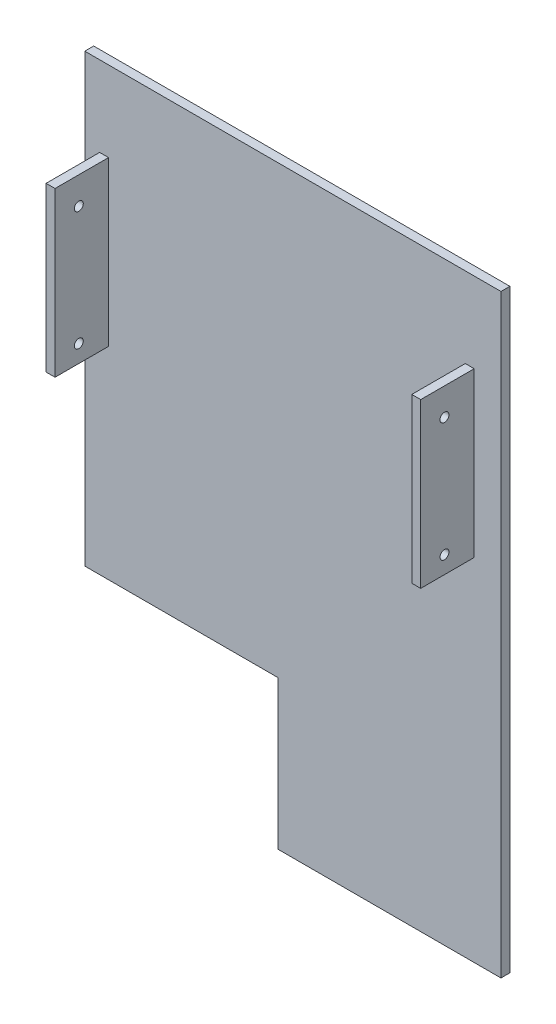
ISO-10303-21;
HEADER;
FILE_DESCRIPTION(('STEP AP214'),'2;1');
FILE_NAME('part.step','',(''),(''),'','','');
FILE_SCHEMA(('AUTOMOTIVE_DESIGN { 1 0 10303 214 1 1 1 1 }'));
ENDSEC;
DATA;
#1=APPLICATION_CONTEXT('core data for automotive mechanical design processes');
#2=APPLICATION_PROTOCOL_DEFINITION('international standard','automotive_design',2000,#1);
#3=PRODUCT_CONTEXT('',#1,'mechanical');
#4=PRODUCT('Part','Part','',(#3));
#5=PRODUCT_RELATED_PRODUCT_CATEGORY('part','',(#4));
#6=PRODUCT_DEFINITION_FORMATION('','',#4);
#7=PRODUCT_DEFINITION_CONTEXT('part definition',#1,'design');
#8=PRODUCT_DEFINITION('design','',#6,#7);
#9=PRODUCT_DEFINITION_SHAPE('','',#8);
#10=(LENGTH_UNIT() NAMED_UNIT(*) SI_UNIT(.MILLI.,.METRE.));
#11=(NAMED_UNIT(*) PLANE_ANGLE_UNIT() SI_UNIT($,.RADIAN.));
#12=(NAMED_UNIT(*) SI_UNIT($,.STERADIAN.) SOLID_ANGLE_UNIT());
#13=UNCERTAINTY_MEASURE_WITH_UNIT(LENGTH_MEASURE(1.E-05),#10,'distance_accuracy_value','');
#14=(GEOMETRIC_REPRESENTATION_CONTEXT(3) GLOBAL_UNCERTAINTY_ASSIGNED_CONTEXT((#13)) GLOBAL_UNIT_ASSIGNED_CONTEXT((#10,
#11,#12)) REPRESENTATION_CONTEXT('',''));
#15=CARTESIAN_POINT('',(0.,0.,0.));
#16=DIRECTION('',(0.,0.,1.));
#17=DIRECTION('',(1.,0.,0.));
#18=AXIS2_PLACEMENT_3D('',#15,#16,#17);
#19=CARTESIAN_POINT('',(0.,0.,3.));
#20=DIRECTION('',(0.,0.,1.));
#21=DIRECTION('',(1.,0.,0.));
#22=AXIS2_PLACEMENT_3D('',#19,#20,#21);
#23=PLANE('',#22);
#24=DIRECTION('',(1.,0.,0.));
#25=VECTOR('',#24,1.);
#26=CARTESIAN_POINT('',(0.,-27.,3.));
#27=LINE('',#26,#25);
#28=CARTESIAN_POINT('',(5.,-27.,3.));
#29=VERTEX_POINT('',#28);
#30=CARTESIAN_POINT('',(8.,-27.,3.));
#31=VERTEX_POINT('',#30);
#32=EDGE_CURVE('E177',#29,#31,#27,.T.);
#33=ORIENTED_EDGE('',*,*,#32,.T.);
#34=DIRECTION('',(0.,-1.,0.));
#35=VECTOR('',#34,1.);
#36=CARTESIAN_POINT('',(8.,0.,3.));
#37=LINE('',#36,#35);
#38=CARTESIAN_POINT('',(8.,-82.,3.));
#39=VERTEX_POINT('',#38);
#40=EDGE_CURVE('E187',#31,#39,#37,.T.);
#41=ORIENTED_EDGE('',*,*,#40,.T.);
#42=DIRECTION('',(1.,0.,0.));
#43=VECTOR('',#42,1.);
#44=CARTESIAN_POINT('',(0.,-82.,3.));
#45=LINE('',#44,#43);
#46=CARTESIAN_POINT('',(5.00000000000001,-82.,3.));
#47=VERTEX_POINT('',#46);
#48=EDGE_CURVE('E197',#47,#39,#45,.T.);
#49=ORIENTED_EDGE('',*,*,#48,.F.);
#50=DIRECTION('',(0.,-1.,0.));
#51=VECTOR('',#50,1.);
#52=CARTESIAN_POINT('',(5.,0.,3.));
#53=LINE('',#52,#51);
#54=EDGE_CURVE('E62',#29,#47,#53,.T.);
#55=ORIENTED_EDGE('',*,*,#54,.F.);
#56=EDGE_LOOP('',(#33,#41,#49,#55));
#57=FACE_BOUND('',#56,.T.);
#58=DIRECTION('',(0.,1.,0.));
#59=VECTOR('',#58,1.);
#60=CARTESIAN_POINT('',(65.,0.,3.));
#61=LINE('',#60,#59);
#62=CARTESIAN_POINT('',(65.,-200.,3.));
#63=VERTEX_POINT('',#62);
#64=CARTESIAN_POINT('',(65.,-150.,3.));
#65=VERTEX_POINT('',#64);
#66=EDGE_CURVE('E225',#63,#65,#61,.T.);
#67=ORIENTED_EDGE('',*,*,#66,.F.);
#68=DIRECTION('',(1.,0.,0.));
#69=VECTOR('',#68,1.);
#70=CARTESIAN_POINT('',(0.,-200.,3.));
#71=LINE('',#70,#69);
#72=CARTESIAN_POINT('',(140.,-200.,3.));
#73=VERTEX_POINT('',#72);
#74=EDGE_CURVE('E231',#63,#73,#71,.T.);
#75=ORIENTED_EDGE('',*,*,#74,.T.);
#76=DIRECTION('',(0.,1.,0.));
#77=VECTOR('',#76,1.);
#78=CARTESIAN_POINT('',(140.,0.,3.));
#79=LINE('',#78,#77);
#80=CARTESIAN_POINT('',(140.,0.,3.));
#81=VERTEX_POINT('',#80);
#82=EDGE_CURVE('E234',#73,#81,#79,.T.);
#83=ORIENTED_EDGE('',*,*,#82,.T.);
#84=DIRECTION('',(-1.,0.,0.));
#85=VECTOR('',#84,1.);
#86=CARTESIAN_POINT('',(0.,0.,3.));
#87=LINE('',#86,#85);
#88=CARTESIAN_POINT('',(0.,0.,3.));
#89=VERTEX_POINT('',#88);
#90=EDGE_CURVE('E236',#81,#89,#87,.T.);
#91=ORIENTED_EDGE('',*,*,#90,.T.);
#92=DIRECTION('',(0.,-1.,0.));
#93=VECTOR('',#92,1.);
#94=CARTESIAN_POINT('',(0.,0.,3.));
#95=LINE('',#94,#93);
#96=CARTESIAN_POINT('',(0.,-150.,3.));
#97=VERTEX_POINT('',#96);
#98=EDGE_CURVE('E228',#89,#97,#95,.T.);
#99=ORIENTED_EDGE('',*,*,#98,.T.);
#100=DIRECTION('',(-1.,0.,0.));
#101=VECTOR('',#100,1.);
#102=CARTESIAN_POINT('',(0.,-150.,3.));
#103=LINE('',#102,#101);
#104=EDGE_CURVE('E219',#65,#97,#103,.T.);
#105=ORIENTED_EDGE('',*,*,#104,.F.);
#106=EDGE_LOOP('',(#67,#75,#83,#91,#99,#105));
#107=FACE_BOUND('',#106,.T.);
#108=DIRECTION('',(0.,1.,0.));
#109=VECTOR('',#108,1.);
#110=CARTESIAN_POINT('',(128.,-82.,3.));
#111=LINE('',#110,#109);
#112=CARTESIAN_POINT('',(128.,-82.,3.));
#113=VERTEX_POINT('',#112);
#114=CARTESIAN_POINT('',(128.,-27.,3.));
#115=VERTEX_POINT('',#114);
#116=EDGE_CURVE('E54',#113,#115,#111,.T.);
#117=ORIENTED_EDGE('',*,*,#116,.T.);
#118=DIRECTION('',(-1.,0.,0.));
#119=VECTOR('',#118,1.);
#120=CARTESIAN_POINT('',(131.,-27.,3.));
#121=LINE('',#120,#119);
#122=CARTESIAN_POINT('',(131.,-27.,3.));
#123=VERTEX_POINT('',#122);
#124=EDGE_CURVE('E506',#123,#115,#121,.T.);
#125=ORIENTED_EDGE('',*,*,#124,.F.);
#126=DIRECTION('',(0.,1.,0.));
#127=VECTOR('',#126,1.);
#128=CARTESIAN_POINT('',(131.,-82.,3.));
#129=LINE('',#128,#127);
#130=CARTESIAN_POINT('',(131.,-82.,3.));
#131=VERTEX_POINT('',#130);
#132=EDGE_CURVE('E159',#131,#123,#129,.T.);
#133=ORIENTED_EDGE('',*,*,#132,.F.);
#134=DIRECTION('',(-1.,0.,0.));
#135=VECTOR('',#134,1.);
#136=CARTESIAN_POINT('',(131.,-82.,3.));
#137=LINE('',#136,#135);
#138=EDGE_CURVE('E170',#131,#113,#137,.T.);
#139=ORIENTED_EDGE('',*,*,#138,.T.);
#140=EDGE_LOOP('',(#117,#125,#133,#139));
#141=FACE_BOUND('',#140,.T.);
#142=ADVANCED_FACE('F39',(#57,#107,#141),#23,.T.);
#143=CARTESIAN_POINT('',(0.,0.,3.));
#144=DIRECTION('',(1.,0.,0.));
#145=DIRECTION('',(0.,1.,0.));
#146=AXIS2_PLACEMENT_3D('',#143,#144,#145);
#147=PLANE('',#146);
#148=DIRECTION('',(0.,-1.,0.));
#149=VECTOR('',#148,1.);
#150=CARTESIAN_POINT('',(0.,0.,0.));
#151=LINE('',#150,#149);
#152=CARTESIAN_POINT('',(0.,0.,0.));
#153=VERTEX_POINT('',#152);
#154=CARTESIAN_POINT('',(0.,-150.,0.));
#155=VERTEX_POINT('',#154);
#156=EDGE_CURVE('E227',#153,#155,#151,.T.);
#157=ORIENTED_EDGE('',*,*,#156,.T.);
#158=DIRECTION('',(0.,0.,-1.));
#159=VECTOR('',#158,1.);
#160=CARTESIAN_POINT('',(0.,-150.,10.));
#161=LINE('',#160,#159);
#162=EDGE_CURVE('E220',#97,#155,#161,.T.);
#163=ORIENTED_EDGE('',*,*,#162,.F.);
#164=ORIENTED_EDGE('',*,*,#98,.F.);
#165=DIRECTION('',(0.,0.,-1.));
#166=VECTOR('',#165,1.);
#167=CARTESIAN_POINT('',(0.,0.,3.));
#168=LINE('',#167,#166);
#169=EDGE_CURVE('E238',#89,#153,#168,.T.);
#170=ORIENTED_EDGE('',*,*,#169,.T.);
#171=EDGE_LOOP('',(#157,#163,#164,#170));
#172=FACE_BOUND('',#171,.T.);
#173=ADVANCED_FACE('F41',(#172),#147,.F.);
#174=CARTESIAN_POINT('',(0.,-200.,3.));
#175=DIRECTION('',(0.,1.,0.));
#176=DIRECTION('',(0.,0.,1.));
#177=AXIS2_PLACEMENT_3D('',#174,#175,#176);
#178=PLANE('',#177);
#179=ORIENTED_EDGE('',*,*,#74,.F.);
#180=DIRECTION('',(0.,0.,-1.));
#181=VECTOR('',#180,1.);
#182=CARTESIAN_POINT('',(65.,-200.,10.));
#183=LINE('',#182,#181);
#184=CARTESIAN_POINT('',(65.,-200.,0.));
#185=VERTEX_POINT('',#184);
#186=EDGE_CURVE('E216',#63,#185,#183,.T.);
#187=ORIENTED_EDGE('',*,*,#186,.T.);
#188=DIRECTION('',(1.,0.,0.));
#189=VECTOR('',#188,1.);
#190=CARTESIAN_POINT('',(0.,-200.,0.));
#191=LINE('',#190,#189);
#192=CARTESIAN_POINT('',(140.,-200.,0.));
#193=VERTEX_POINT('',#192);
#194=EDGE_CURVE('E241',#185,#193,#191,.T.);
#195=ORIENTED_EDGE('',*,*,#194,.T.);
#196=DIRECTION('',(0.,0.,-1.));
#197=VECTOR('',#196,1.);
#198=CARTESIAN_POINT('',(140.,-200.,3.));
#199=LINE('',#198,#197);
#200=EDGE_CURVE('E11',#73,#193,#199,.T.);
#201=ORIENTED_EDGE('',*,*,#200,.F.);
#202=EDGE_LOOP('',(#179,#187,#195,#201));
#203=FACE_BOUND('',#202,.T.);
#204=ADVANCED_FACE('F274',(#203),#178,.F.);
#205=CARTESIAN_POINT('',(140.,0.,3.));
#206=DIRECTION('',(-1.,0.,0.));
#207=DIRECTION('',(0.,-1.,0.));
#208=AXIS2_PLACEMENT_3D('',#205,#206,#207);
#209=PLANE('',#208);
#210=DIRECTION('',(0.,1.,0.));
#211=VECTOR('',#210,1.);
#212=CARTESIAN_POINT('',(140.,0.,0.));
#213=LINE('',#212,#211);
#214=CARTESIAN_POINT('',(140.,0.,0.));
#215=VERTEX_POINT('',#214);
#216=EDGE_CURVE('E243',#193,#215,#213,.T.);
#217=ORIENTED_EDGE('',*,*,#216,.T.);
#218=DIRECTION('',(0.,0.,-1.));
#219=VECTOR('',#218,1.);
#220=CARTESIAN_POINT('',(140.,0.,3.));
#221=LINE('',#220,#219);
#222=EDGE_CURVE('E47',#81,#215,#221,.T.);
#223=ORIENTED_EDGE('',*,*,#222,.F.);
#224=ORIENTED_EDGE('',*,*,#82,.F.);
#225=ORIENTED_EDGE('',*,*,#200,.T.);
#226=EDGE_LOOP('',(#217,#223,#224,#225));
#227=FACE_BOUND('',#226,.T.);
#228=ADVANCED_FACE('F272',(#227),#209,.F.);
#229=CARTESIAN_POINT('',(0.,0.,3.));
#230=DIRECTION('',(0.,-1.,0.));
#231=DIRECTION('',(0.,0.,-1.));
#232=AXIS2_PLACEMENT_3D('',#229,#230,#231);
#233=PLANE('',#232);
#234=DIRECTION('',(-1.,0.,0.));
#235=VECTOR('',#234,1.);
#236=CARTESIAN_POINT('',(0.,0.,0.));
#237=LINE('',#236,#235);
#238=EDGE_CURVE('E232',#215,#153,#237,.T.);
#239=ORIENTED_EDGE('',*,*,#238,.T.);
#240=ORIENTED_EDGE('',*,*,#169,.F.);
#241=ORIENTED_EDGE('',*,*,#90,.F.);
#242=ORIENTED_EDGE('',*,*,#222,.T.);
#243=EDGE_LOOP('',(#239,#240,#241,#242));
#244=FACE_BOUND('',#243,.T.);
#245=ADVANCED_FACE('F252',(#244),#233,.F.);
#246=CARTESIAN_POINT('',(0.,0.,0.));
#247=DIRECTION('',(0.,0.,1.));
#248=DIRECTION('',(1.,0.,0.));
#249=AXIS2_PLACEMENT_3D('',#246,#247,#248);
#250=PLANE('',#249);
#251=ORIENTED_EDGE('',*,*,#194,.F.);
#252=DIRECTION('',(0.,-1.,0.));
#253=VECTOR('',#252,1.);
#254=CARTESIAN_POINT('',(65.,-200.,0.));
#255=LINE('',#254,#253);
#256=CARTESIAN_POINT('',(65.,-150.,0.));
#257=VERTEX_POINT('',#256);
#258=EDGE_CURVE('E211',#257,#185,#255,.T.);
#259=ORIENTED_EDGE('',*,*,#258,.F.);
#260=DIRECTION('',(1.,0.,0.));
#261=VECTOR('',#260,1.);
#262=CARTESIAN_POINT('',(65.,-150.,0.));
#263=LINE('',#262,#261);
#264=EDGE_CURVE('E213',#155,#257,#263,.T.);
#265=ORIENTED_EDGE('',*,*,#264,.F.);
#266=ORIENTED_EDGE('',*,*,#156,.F.);
#267=ORIENTED_EDGE('',*,*,#238,.F.);
#268=ORIENTED_EDGE('',*,*,#216,.F.);
#269=EDGE_LOOP('',(#251,#259,#265,#266,#267,#268));
#270=FACE_BOUND('',#269,.T.);
#271=ADVANCED_FACE('F260',(#270),#250,.F.);
#272=CARTESIAN_POINT('',(65.,-200.,10.));
#273=DIRECTION('',(1.,0.,0.));
#274=DIRECTION('',(0.,0.,-1.));
#275=AXIS2_PLACEMENT_3D('',#272,#273,#274);
#276=PLANE('',#275);
#277=ORIENTED_EDGE('',*,*,#66,.T.);
#278=DIRECTION('',(0.,0.,-1.));
#279=VECTOR('',#278,1.);
#280=CARTESIAN_POINT('',(65.,-150.,10.));
#281=LINE('',#280,#279);
#282=EDGE_CURVE('E217',#65,#257,#281,.T.);
#283=ORIENTED_EDGE('',*,*,#282,.T.);
#284=ORIENTED_EDGE('',*,*,#258,.T.);
#285=ORIENTED_EDGE('',*,*,#186,.F.);
#286=EDGE_LOOP('',(#277,#283,#284,#285));
#287=FACE_BOUND('',#286,.T.);
#288=ADVANCED_FACE('F276',(#287),#276,.F.);
#289=CARTESIAN_POINT('',(65.,-150.,10.));
#290=DIRECTION('',(0.,1.,0.));
#291=DIRECTION('',(0.,0.,1.));
#292=AXIS2_PLACEMENT_3D('',#289,#290,#291);
#293=PLANE('',#292);
#294=ORIENTED_EDGE('',*,*,#104,.T.);
#295=ORIENTED_EDGE('',*,*,#162,.T.);
#296=ORIENTED_EDGE('',*,*,#264,.T.);
#297=ORIENTED_EDGE('',*,*,#282,.F.);
#298=EDGE_LOOP('',(#294,#295,#296,#297));
#299=FACE_BOUND('',#298,.T.);
#300=ADVANCED_FACE('F279',(#299),#293,.F.);
#301=CARTESIAN_POINT('',(0.,-27.,21.));
#302=DIRECTION('',(0.,1.,0.));
#303=DIRECTION('',(0.,0.,1.));
#304=AXIS2_PLACEMENT_3D('',#301,#302,#303);
#305=PLANE('',#304);
#306=ORIENTED_EDGE('',*,*,#32,.F.);
#307=DIRECTION('',(0.,0.,-1.));
#308=VECTOR('',#307,1.);
#309=CARTESIAN_POINT('',(5.,-27.,21.));
#310=LINE('',#309,#308);
#311=CARTESIAN_POINT('',(5.,-27.,21.));
#312=VERTEX_POINT('',#311);
#313=EDGE_CURVE('E209',#312,#29,#310,.T.);
#314=ORIENTED_EDGE('',*,*,#313,.F.);
#315=DIRECTION('',(1.,0.,0.));
#316=VECTOR('',#315,1.);
#317=CARTESIAN_POINT('',(0.,-27.,21.));
#318=LINE('',#317,#316);
#319=CARTESIAN_POINT('',(8.,-27.,21.));
#320=VERTEX_POINT('',#319);
#321=EDGE_CURVE('E183',#312,#320,#318,.T.);
#322=ORIENTED_EDGE('',*,*,#321,.T.);
#323=DIRECTION('',(0.,0.,-1.));
#324=VECTOR('',#323,1.);
#325=CARTESIAN_POINT('',(8.,-27.,21.));
#326=LINE('',#325,#324);
#327=EDGE_CURVE('E194',#320,#31,#326,.T.);
#328=ORIENTED_EDGE('',*,*,#327,.T.);
#329=EDGE_LOOP('',(#306,#314,#322,#328));
#330=FACE_BOUND('',#329,.T.);
#331=ADVANCED_FACE('F281',(#330),#305,.T.);
#332=CARTESIAN_POINT('',(5.,0.,21.));
#333=DIRECTION('',(1.,0.,0.));
#334=DIRECTION('',(0.,1.,0.));
#335=AXIS2_PLACEMENT_3D('',#332,#333,#334);
#336=PLANE('',#335);
#337=CARTESIAN_POINT('',(5.00000000000001,-76.1644741197591,13.0000000000001));
#338=DIRECTION('',(-1.,0.,0.));
#339=DIRECTION('',(0.,-1.,0.));
#340=AXIS2_PLACEMENT_3D('',#337,#338,#339);
#341=CIRCLE('',#340,1.5);
#342=CARTESIAN_POINT('',(5.00000000000001,-77.6644741197591,13.0000000000001));
#343=VERTEX_POINT('',#342);
#344=EDGE_CURVE('E174',#343,#343,#341,.T.);
#345=ORIENTED_EDGE('',*,*,#344,.F.);
#346=EDGE_LOOP('',(#345));
#347=FACE_BOUND('',#346,.T.);
#348=CARTESIAN_POINT('',(5.,-36.1644741197591,13.0000000000001));
#349=DIRECTION('',(-1.,0.,0.));
#350=DIRECTION('',(0.,-1.,0.));
#351=AXIS2_PLACEMENT_3D('',#348,#349,#350);
#352=CIRCLE('',#351,1.5);
#353=CARTESIAN_POINT('',(5.,-37.6644741197591,13.0000000000001));
#354=VERTEX_POINT('',#353);
#355=EDGE_CURVE('E165',#354,#354,#352,.T.);
#356=ORIENTED_EDGE('',*,*,#355,.F.);
#357=EDGE_LOOP('',(#356));
#358=FACE_BOUND('',#357,.T.);
#359=ORIENTED_EDGE('',*,*,#54,.T.);
#360=DIRECTION('',(0.,0.,-1.));
#361=VECTOR('',#360,1.);
#362=CARTESIAN_POINT('',(5.00000000000001,-82.,21.));
#363=LINE('',#362,#361);
#364=CARTESIAN_POINT('',(5.00000000000001,-82.,21.));
#365=VERTEX_POINT('',#364);
#366=EDGE_CURVE('E206',#365,#47,#363,.T.);
#367=ORIENTED_EDGE('',*,*,#366,.F.);
#368=DIRECTION('',(0.,-1.,0.));
#369=VECTOR('',#368,1.);
#370=CARTESIAN_POINT('',(5.,0.,21.));
#371=LINE('',#370,#369);
#372=EDGE_CURVE('E186',#312,#365,#371,.T.);
#373=ORIENTED_EDGE('',*,*,#372,.F.);
#374=ORIENTED_EDGE('',*,*,#313,.T.);
#375=EDGE_LOOP('',(#359,#367,#373,#374));
#376=FACE_BOUND('',#375,.T.);
#377=ADVANCED_FACE('F287',(#347,#358,#376),#336,.F.);
#378=CARTESIAN_POINT('',(0.,-82.,21.));
#379=DIRECTION('',(0.,1.,0.));
#380=DIRECTION('',(0.,0.,1.));
#381=AXIS2_PLACEMENT_3D('',#378,#379,#380);
#382=PLANE('',#381);
#383=ORIENTED_EDGE('',*,*,#48,.T.);
#384=DIRECTION('',(0.,0.,-1.));
#385=VECTOR('',#384,1.);
#386=CARTESIAN_POINT('',(8.,-82.,21.));
#387=LINE('',#386,#385);
#388=CARTESIAN_POINT('',(8.,-82.,21.));
#389=VERTEX_POINT('',#388);
#390=EDGE_CURVE('E203',#389,#39,#387,.T.);
#391=ORIENTED_EDGE('',*,*,#390,.F.);
#392=DIRECTION('',(1.,0.,0.));
#393=VECTOR('',#392,1.);
#394=CARTESIAN_POINT('',(0.,-82.,21.));
#395=LINE('',#394,#393);
#396=EDGE_CURVE('E189',#365,#389,#395,.T.);
#397=ORIENTED_EDGE('',*,*,#396,.F.);
#398=ORIENTED_EDGE('',*,*,#366,.T.);
#399=EDGE_LOOP('',(#383,#391,#397,#398));
#400=FACE_BOUND('',#399,.T.);
#401=ADVANCED_FACE('F343',(#400),#382,.F.);
#402=CARTESIAN_POINT('',(8.,0.,21.));
#403=DIRECTION('',(1.,0.,0.));
#404=DIRECTION('',(0.,0.,-1.));
#405=AXIS2_PLACEMENT_3D('',#402,#403,#404);
#406=PLANE('',#405);
#407=CARTESIAN_POINT('',(8.00000000000001,-76.1644741197591,13.0000000000001));
#408=DIRECTION('',(1.,0.,0.));
#409=DIRECTION('',(0.,0.,-1.));
#410=AXIS2_PLACEMENT_3D('',#407,#408,#409);
#411=CIRCLE('',#410,1.5);
#412=CARTESIAN_POINT('',(8.00000000000001,-76.1644741197591,11.5000000000001));
#413=VERTEX_POINT('',#412);
#414=EDGE_CURVE('E178',#413,#413,#411,.F.);
#415=ORIENTED_EDGE('',*,*,#414,.T.);
#416=EDGE_LOOP('',(#415));
#417=FACE_BOUND('',#416,.T.);
#418=CARTESIAN_POINT('',(8.00000000000001,-36.1644741197591,13.0000000000001));
#419=DIRECTION('',(1.,0.,0.));
#420=DIRECTION('',(0.,0.,-1.));
#421=AXIS2_PLACEMENT_3D('',#418,#419,#420);
#422=CIRCLE('',#421,1.5);
#423=CARTESIAN_POINT('',(8.00000000000001,-36.1644741197591,11.5000000000001));
#424=VERTEX_POINT('',#423);
#425=EDGE_CURVE('E168',#424,#424,#422,.F.);
#426=ORIENTED_EDGE('',*,*,#425,.T.);
#427=EDGE_LOOP('',(#426));
#428=FACE_BOUND('',#427,.T.);
#429=ORIENTED_EDGE('',*,*,#40,.F.);
#430=ORIENTED_EDGE('',*,*,#327,.F.);
#431=DIRECTION('',(0.,-1.,0.));
#432=VECTOR('',#431,1.);
#433=CARTESIAN_POINT('',(8.,0.,21.));
#434=LINE('',#433,#432);
#435=EDGE_CURVE('E191',#320,#389,#434,.T.);
#436=ORIENTED_EDGE('',*,*,#435,.T.);
#437=ORIENTED_EDGE('',*,*,#390,.T.);
#438=EDGE_LOOP('',(#429,#430,#436,#437));
#439=FACE_BOUND('',#438,.T.);
#440=ADVANCED_FACE('F348',(#417,#428,#439),#406,.T.);
#441=CARTESIAN_POINT('',(0.,0.,21.));
#442=DIRECTION('',(0.,0.,1.));
#443=DIRECTION('',(1.,0.,0.));
#444=AXIS2_PLACEMENT_3D('',#441,#442,#443);
#445=PLANE('',#444);
#446=ORIENTED_EDGE('',*,*,#321,.F.);
#447=ORIENTED_EDGE('',*,*,#372,.T.);
#448=ORIENTED_EDGE('',*,*,#396,.T.);
#449=ORIENTED_EDGE('',*,*,#435,.F.);
#450=EDGE_LOOP('',(#446,#447,#448,#449));
#451=FACE_BOUND('',#450,.T.);
#452=ADVANCED_FACE('F357',(#451),#445,.T.);
#453=CARTESIAN_POINT('',(140.001,-36.164474119759,13.0000000000001));
#454=DIRECTION('',(-1.,0.,0.));
#455=DIRECTION('',(0.,-1.,0.));
#456=AXIS2_PLACEMENT_3D('',#453,#454,#455);
#457=CYLINDRICAL_SURFACE('',#456,1.5);
#458=ORIENTED_EDGE('',*,*,#425,.F.);
#459=EDGE_LOOP('',(#458));
#460=FACE_BOUND('',#459,.T.);
#461=ORIENTED_EDGE('',*,*,#355,.T.);
#462=EDGE_LOOP('',(#461));
#463=FACE_BOUND('',#462,.T.);
#464=ADVANCED_FACE('F362',(#460,#463),#457,.F.);
#465=CARTESIAN_POINT('',(140.001,-76.164474119759,13.0000000000001));
#466=DIRECTION('',(-1.,0.,0.));
#467=DIRECTION('',(0.,-1.,0.));
#468=AXIS2_PLACEMENT_3D('',#465,#466,#467);
#469=CYLINDRICAL_SURFACE('',#468,1.5);
#470=ORIENTED_EDGE('',*,*,#414,.F.);
#471=EDGE_LOOP('',(#470));
#472=FACE_BOUND('',#471,.T.);
#473=ORIENTED_EDGE('',*,*,#344,.T.);
#474=EDGE_LOOP('',(#473));
#475=FACE_BOUND('',#474,.T.);
#476=ADVANCED_FACE('F389',(#472,#475),#469,.F.);
#477=CARTESIAN_POINT('',(131.,0.,0.));
#478=DIRECTION('',(1.,0.,0.));
#479=DIRECTION('',(0.,0.,-1.));
#480=AXIS2_PLACEMENT_3D('',#477,#478,#479);
#481=PLANE('',#480);
#482=CARTESIAN_POINT('',(131.,-76.1644741197591,13.0000000000001));
#483=DIRECTION('',(1.,0.,0.));
#484=DIRECTION('',(0.,0.,-1.));
#485=AXIS2_PLACEMENT_3D('',#482,#483,#484);
#486=CIRCLE('',#485,1.5);
#487=CARTESIAN_POINT('',(131.,-76.1644741197591,11.5000000000001));
#488=VERTEX_POINT('',#487);
#489=EDGE_CURVE('E499',#488,#488,#486,.T.);
#490=ORIENTED_EDGE('',*,*,#489,.F.);
#491=EDGE_LOOP('',(#490));
#492=FACE_BOUND('',#491,.T.);
#493=DIRECTION('',(0.,0.,1.));
#494=VECTOR('',#493,1.);
#495=CARTESIAN_POINT('',(131.,-27.,3.));
#496=LINE('',#495,#494);
#497=CARTESIAN_POINT('',(131.,-27.,21.));
#498=VERTEX_POINT('',#497);
#499=EDGE_CURVE('E153',#123,#498,#496,.T.);
#500=ORIENTED_EDGE('',*,*,#499,.T.);
#501=DIRECTION('',(0.,-1.,0.));
#502=VECTOR('',#501,1.);
#503=CARTESIAN_POINT('',(131.,-27.,21.));
#504=LINE('',#503,#502);
#505=CARTESIAN_POINT('',(131.,-82.,21.));
#506=VERTEX_POINT('',#505);
#507=EDGE_CURVE('E142',#498,#506,#504,.T.);
#508=ORIENTED_EDGE('',*,*,#507,.T.);
#509=DIRECTION('',(0.,0.,-1.));
#510=VECTOR('',#509,1.);
#511=CARTESIAN_POINT('',(131.,-82.,21.));
#512=LINE('',#511,#510);
#513=EDGE_CURVE('E152',#506,#131,#512,.T.);
#514=ORIENTED_EDGE('',*,*,#513,.T.);
#515=ORIENTED_EDGE('',*,*,#132,.T.);
#516=EDGE_LOOP('',(#500,#508,#514,#515));
#517=FACE_BOUND('',#516,.T.);
#518=CARTESIAN_POINT('',(131.,-36.1644741197591,13.0000000000001));
#519=DIRECTION('',(1.,0.,0.));
#520=DIRECTION('',(0.,0.,-1.));
#521=AXIS2_PLACEMENT_3D('',#518,#519,#520);
#522=CIRCLE('',#521,1.5);
#523=CARTESIAN_POINT('',(131.,-36.1644741197591,11.5000000000001));
#524=VERTEX_POINT('',#523);
#525=EDGE_CURVE('E490',#524,#524,#522,.T.);
#526=ORIENTED_EDGE('',*,*,#525,.F.);
#527=EDGE_LOOP('',(#526));
#528=FACE_BOUND('',#527,.T.);
#529=ADVANCED_FACE('F156',(#492,#517,#528),#481,.T.);
#530=CARTESIAN_POINT('',(128.,0.,0.));
#531=DIRECTION('',(1.,0.,0.));
#532=DIRECTION('',(0.,0.,-1.));
#533=AXIS2_PLACEMENT_3D('',#530,#531,#532);
#534=PLANE('',#533);
#535=DIRECTION('',(0.,0.,1.));
#536=VECTOR('',#535,1.);
#537=CARTESIAN_POINT('',(128.,-27.,3.));
#538=LINE('',#537,#536);
#539=CARTESIAN_POINT('',(128.,-27.,21.));
#540=VERTEX_POINT('',#539);
#541=EDGE_CURVE('E164',#115,#540,#538,.T.);
#542=ORIENTED_EDGE('',*,*,#541,.F.);
#543=ORIENTED_EDGE('',*,*,#116,.F.);
#544=DIRECTION('',(0.,0.,-1.));
#545=VECTOR('',#544,1.);
#546=CARTESIAN_POINT('',(128.,-82.,21.));
#547=LINE('',#546,#545);
#548=CARTESIAN_POINT('',(128.,-82.,21.));
#549=VERTEX_POINT('',#548);
#550=EDGE_CURVE('E510',#549,#113,#547,.T.);
#551=ORIENTED_EDGE('',*,*,#550,.F.);
#552=DIRECTION('',(0.,-1.,0.));
#553=VECTOR('',#552,1.);
#554=CARTESIAN_POINT('',(128.,-27.,21.));
#555=LINE('',#554,#553);
#556=EDGE_CURVE('E508',#540,#549,#555,.T.);
#557=ORIENTED_EDGE('',*,*,#556,.F.);
#558=EDGE_LOOP('',(#542,#543,#551,#557));
#559=FACE_BOUND('',#558,.T.);
#560=CARTESIAN_POINT('',(128.,-76.1644741197591,13.0000000000001));
#561=DIRECTION('',(1.,0.,0.));
#562=DIRECTION('',(0.,0.,-1.));
#563=AXIS2_PLACEMENT_3D('',#560,#561,#562);
#564=CIRCLE('',#563,1.5);
#565=CARTESIAN_POINT('',(128.,-76.1644741197591,11.5000000000001));
#566=VERTEX_POINT('',#565);
#567=EDGE_CURVE('E496',#566,#566,#564,.T.);
#568=ORIENTED_EDGE('',*,*,#567,.T.);
#569=EDGE_LOOP('',(#568));
#570=FACE_BOUND('',#569,.T.);
#571=CARTESIAN_POINT('',(128.,-36.1644741197591,13.0000000000001));
#572=DIRECTION('',(1.,0.,0.));
#573=DIRECTION('',(0.,0.,-1.));
#574=AXIS2_PLACEMENT_3D('',#571,#572,#573);
#575=CIRCLE('',#574,1.5);
#576=CARTESIAN_POINT('',(128.,-36.1644741197591,11.5000000000001));
#577=VERTEX_POINT('',#576);
#578=EDGE_CURVE('E493',#577,#577,#575,.T.);
#579=ORIENTED_EDGE('',*,*,#578,.T.);
#580=EDGE_LOOP('',(#579));
#581=FACE_BOUND('',#580,.T.);
#582=ADVANCED_FACE('F415',(#559,#570,#581),#534,.F.);
#583=CARTESIAN_POINT('',(131.,-27.,3.));
#584=DIRECTION('',(0.,-1.,0.));
#585=DIRECTION('',(0.,0.,-1.));
#586=AXIS2_PLACEMENT_3D('',#583,#584,#585);
#587=PLANE('',#586);
#588=ORIENTED_EDGE('',*,*,#541,.T.);
#589=DIRECTION('',(-1.,0.,0.));
#590=VECTOR('',#589,1.);
#591=CARTESIAN_POINT('',(131.,-27.,21.));
#592=LINE('',#591,#590);
#593=EDGE_CURVE('E146',#498,#540,#592,.T.);
#594=ORIENTED_EDGE('',*,*,#593,.F.);
#595=ORIENTED_EDGE('',*,*,#499,.F.);
#596=ORIENTED_EDGE('',*,*,#124,.T.);
#597=EDGE_LOOP('',(#588,#594,#595,#596));
#598=FACE_BOUND('',#597,.T.);
#599=ADVANCED_FACE('F163',(#598),#587,.F.);
#600=CARTESIAN_POINT('',(131.,-27.,21.));
#601=DIRECTION('',(0.,0.,-1.));
#602=DIRECTION('',(-1.,0.,0.));
#603=AXIS2_PLACEMENT_3D('',#600,#601,#602);
#604=PLANE('',#603);
#605=ORIENTED_EDGE('',*,*,#556,.T.);
#606=DIRECTION('',(-1.,0.,0.));
#607=VECTOR('',#606,1.);
#608=CARTESIAN_POINT('',(131.,-82.,21.));
#609=LINE('',#608,#607);
#610=EDGE_CURVE('E149',#506,#549,#609,.T.);
#611=ORIENTED_EDGE('',*,*,#610,.F.);
#612=ORIENTED_EDGE('',*,*,#507,.F.);
#613=ORIENTED_EDGE('',*,*,#593,.T.);
#614=EDGE_LOOP('',(#605,#611,#612,#613));
#615=FACE_BOUND('',#614,.T.);
#616=ADVANCED_FACE('F144',(#615),#604,.F.);
#617=CARTESIAN_POINT('',(131.,-82.,21.));
#618=DIRECTION('',(0.,1.,0.));
#619=DIRECTION('',(0.,0.,1.));
#620=AXIS2_PLACEMENT_3D('',#617,#618,#619);
#621=PLANE('',#620);
#622=ORIENTED_EDGE('',*,*,#550,.T.);
#623=ORIENTED_EDGE('',*,*,#138,.F.);
#624=ORIENTED_EDGE('',*,*,#513,.F.);
#625=ORIENTED_EDGE('',*,*,#610,.T.);
#626=EDGE_LOOP('',(#622,#623,#624,#625));
#627=FACE_BOUND('',#626,.T.);
#628=ADVANCED_FACE('F443',(#627),#621,.F.);
#629=CARTESIAN_POINT('',(131.,-76.1644741197591,13.0000000000001));
#630=DIRECTION('',(-1.,0.,0.));
#631=DIRECTION('',(0.,0.,1.));
#632=AXIS2_PLACEMENT_3D('',#629,#630,#631);
#633=CYLINDRICAL_SURFACE('',#632,1.5);
#634=ORIENTED_EDGE('',*,*,#489,.T.);
#635=EDGE_LOOP('',(#634));
#636=FACE_BOUND('',#635,.T.);
#637=ORIENTED_EDGE('',*,*,#567,.F.);
#638=EDGE_LOOP('',(#637));
#639=FACE_BOUND('',#638,.T.);
#640=ADVANCED_FACE('F453',(#636,#639),#633,.F.);
#641=CARTESIAN_POINT('',(131.,-36.1644741197591,13.0000000000001));
#642=DIRECTION('',(-1.,0.,0.));
#643=DIRECTION('',(0.,0.,1.));
#644=AXIS2_PLACEMENT_3D('',#641,#642,#643);
#645=CYLINDRICAL_SURFACE('',#644,1.5);
#646=ORIENTED_EDGE('',*,*,#525,.T.);
#647=EDGE_LOOP('',(#646));
#648=FACE_BOUND('',#647,.T.);
#649=ORIENTED_EDGE('',*,*,#578,.F.);
#650=EDGE_LOOP('',(#649));
#651=FACE_BOUND('',#650,.T.);
#652=ADVANCED_FACE('F464',(#648,#651),#645,.F.);
#653=CLOSED_SHELL('',(#142,#173,#204,#228,#245,#271,#288,#300,#331,#377,#401,#440,#452,#464,
#476,#529,#582,#599,#616,#628,#640,#652));
#654=MANIFOLD_SOLID_BREP('B2',#653);
#655=ADVANCED_BREP_SHAPE_REPRESENTATION('',(#18,#654),#14);
#656=SHAPE_DEFINITION_REPRESENTATION(#9,#655);
ENDSEC;
END-ISO-10303-21;
